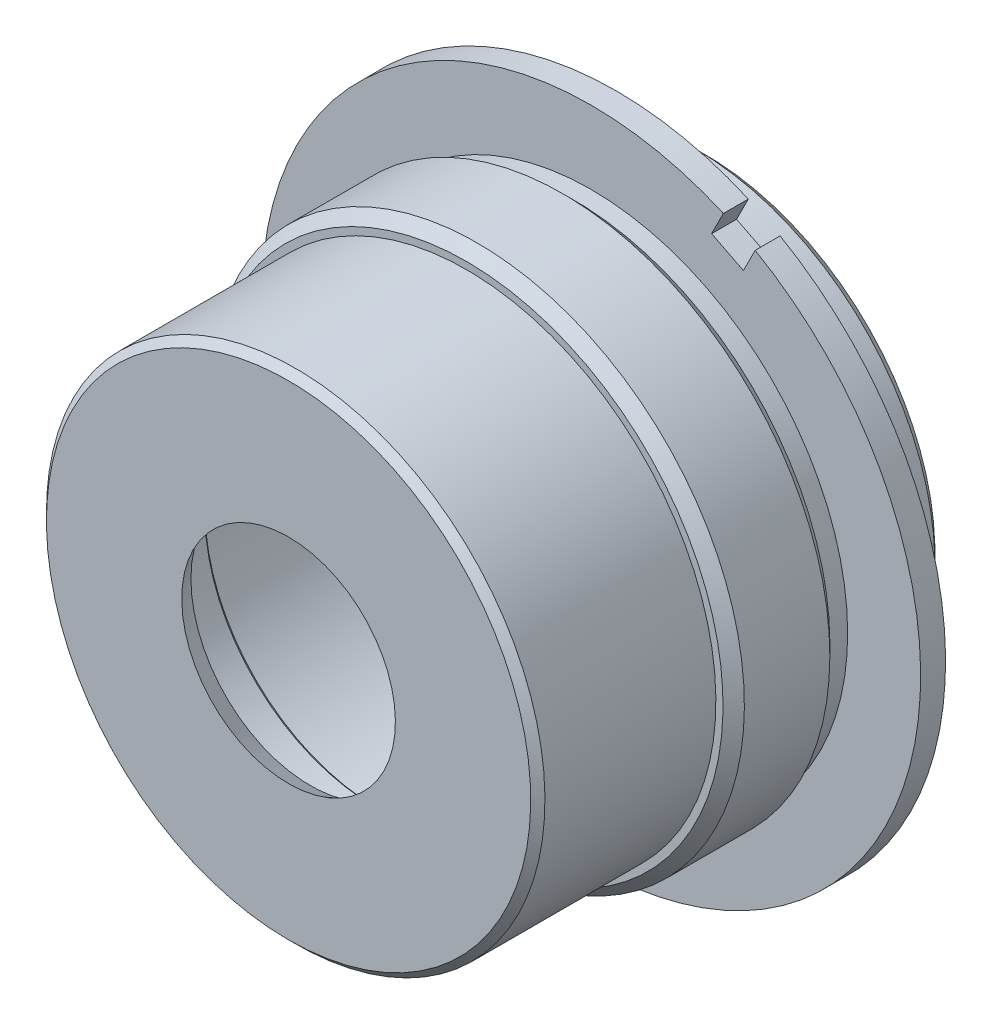
ISO-10303-21;
HEADER;
FILE_DESCRIPTION(('STEP AP214'),'2;1');
FILE_NAME('part.step','',(''),(''),'','','');
FILE_SCHEMA(('AUTOMOTIVE_DESIGN { 1 0 10303 214 1 1 1 1 }'));
ENDSEC;
DATA;
#1=APPLICATION_CONTEXT('core data for automotive mechanical design processes');
#2=APPLICATION_PROTOCOL_DEFINITION('international standard','automotive_design',2000,#1);
#3=PRODUCT_CONTEXT('',#1,'mechanical');
#4=PRODUCT('Part','Part','',(#3));
#5=PRODUCT_RELATED_PRODUCT_CATEGORY('part','',(#4));
#6=PRODUCT_DEFINITION_FORMATION('','',#4);
#7=PRODUCT_DEFINITION_CONTEXT('part definition',#1,'design');
#8=PRODUCT_DEFINITION('design','',#6,#7);
#9=PRODUCT_DEFINITION_SHAPE('','',#8);
#10=(LENGTH_UNIT() NAMED_UNIT(*) SI_UNIT(.MILLI.,.METRE.));
#11=(NAMED_UNIT(*) PLANE_ANGLE_UNIT() SI_UNIT($,.RADIAN.));
#12=(NAMED_UNIT(*) SI_UNIT($,.STERADIAN.) SOLID_ANGLE_UNIT());
#13=UNCERTAINTY_MEASURE_WITH_UNIT(LENGTH_MEASURE(1.E-05),#10,'distance_accuracy_value','');
#14=(GEOMETRIC_REPRESENTATION_CONTEXT(3) GLOBAL_UNCERTAINTY_ASSIGNED_CONTEXT((#13)) GLOBAL_UNIT_ASSIGNED_CONTEXT((#10,
#11,#12)) REPRESENTATION_CONTEXT('',''));
#15=CARTESIAN_POINT('',(0.,0.,0.));
#16=DIRECTION('',(0.,0.,1.));
#17=DIRECTION('',(1.,0.,0.));
#18=AXIS2_PLACEMENT_3D('',#15,#16,#17);
#19=CARTESIAN_POINT('',(-3.37937907791445,-7.81535648884644,0.204999999995237));
#20=DIRECTION('',(0.450102074575118,0.892977111948103,0.));
#21=DIRECTION('',(0.892977111948103,-0.450102074575118,0.));
#22=AXIS2_PLACEMENT_3D('',#19,#20,#21);
#23=PLANE('',#22);
#24=DIRECTION('',(0.,0.,-1.));
#25=VECTOR('',#24,1.);
#26=CARTESIAN_POINT('',(-4.27235618986256,-7.36525441427132,0.204999999995237));
#27=LINE('',#26,#25);
#28=CARTESIAN_POINT('',(-4.27235618986256,-7.36525441427132,-8.29500000000476));
#29=VERTEX_POINT('',#28);
#30=CARTESIAN_POINT('',(-4.27235618986256,-7.36525441427132,-8.995));
#31=VERTEX_POINT('',#30);
#32=EDGE_CURVE('E27',#29,#31,#27,.T.);
#33=ORIENTED_EDGE('',*,*,#32,.T.);
#34=DIRECTION('',(0.892977111948103,-0.450102074575118,0.));
#35=VECTOR('',#34,1.);
#36=CARTESIAN_POINT('',(-3.37937907791445,-7.81535648884644,-8.995));
#37=LINE('',#36,#35);
#38=CARTESIAN_POINT('',(-3.37937907791445,-7.81535648884644,-8.995));
#39=VERTEX_POINT('',#38);
#40=EDGE_CURVE('E265',#31,#39,#37,.T.);
#41=ORIENTED_EDGE('',*,*,#40,.T.);
#42=DIRECTION('',(0.,0.,-1.));
#43=VECTOR('',#42,1.);
#44=CARTESIAN_POINT('',(-3.37937907791445,-7.81535648884644,0.204999999995237));
#45=LINE('',#44,#43);
#46=CARTESIAN_POINT('',(-3.37937907791445,-7.81535648884644,-8.29500000000476));
#47=VERTEX_POINT('',#46);
#48=EDGE_CURVE('E11',#47,#39,#45,.T.);
#49=ORIENTED_EDGE('',*,*,#48,.F.);
#50=DIRECTION('',(0.892977111948103,-0.450102074575118,0.));
#51=VECTOR('',#50,1.);
#52=CARTESIAN_POINT('',(-3.8258676338885,-7.59030545155888,-8.29500000000476));
#53=LINE('',#52,#51);
#54=EDGE_CURVE('E277',#29,#47,#53,.T.);
#55=ORIENTED_EDGE('',*,*,#54,.F.);
#56=EDGE_LOOP('',(#33,#41,#49,#55));
#57=FACE_BOUND('',#56,.T.);
#58=ADVANCED_FACE('F16',(#57),#23,.F.);
#59=CARTESIAN_POINT('',(-3.37937907791445,-7.81535648884644,0.204999999995237));
#60=DIRECTION('',(0.892977111948103,-0.450102074575118,0.));
#61=DIRECTION('',(0.450102074575118,0.892977111948103,0.));
#62=AXIS2_PLACEMENT_3D('',#59,#60,#61);
#63=PLANE('',#62);
#64=ORIENTED_EDGE('',*,*,#48,.T.);
#65=DIRECTION('',(-0.450102074575118,-0.892977111948103,0.));
#66=VECTOR('',#65,1.);
#67=CARTESIAN_POINT('',(-3.37937907791445,-7.81535648884644,-8.995));
#68=LINE('',#67,#66);
#69=CARTESIAN_POINT('',(-3.71086872388059,-8.4730132369851,-8.995));
#70=VERTEX_POINT('',#69);
#71=EDGE_CURVE('E20',#39,#70,#68,.T.);
#72=ORIENTED_EDGE('',*,*,#71,.T.);
#73=DIRECTION('',(0.,0.,-1.));
#74=VECTOR('',#73,1.);
#75=CARTESIAN_POINT('',(-3.71086872388059,-8.4730132369851,1.20499999999524));
#76=LINE('',#75,#74);
#77=CARTESIAN_POINT('',(-3.71086872388059,-8.4730132369851,-8.29500000000476));
#78=VERTEX_POINT('',#77);
#79=EDGE_CURVE('E248',#78,#70,#76,.T.);
#80=ORIENTED_EDGE('',*,*,#79,.F.);
#81=DIRECTION('',(-0.450102074575118,-0.892977111948103,0.));
#82=VECTOR('',#81,1.);
#83=CARTESIAN_POINT('',(4.60993274579388,8.03498724823239,-8.29500000000476));
#84=LINE('',#83,#82);
#85=EDGE_CURVE('E302',#47,#78,#84,.T.);
#86=ORIENTED_EDGE('',*,*,#85,.F.);
#87=EDGE_LOOP('',(#64,#72,#80,#86));
#88=FACE_BOUND('',#87,.T.);
#89=ADVANCED_FACE('F577',(#88),#63,.F.);
#90=CARTESIAN_POINT('',(-4.27235618986256,-7.36525441427132,0.204999999995237));
#91=DIRECTION('',(-0.892977111948103,0.450102074575118,0.));
#92=DIRECTION('',(0.450102074575118,0.892977111948103,0.));
#93=AXIS2_PLACEMENT_3D('',#90,#91,#92);
#94=PLANE('',#93);
#95=DIRECTION('',(0.,0.,1.));
#96=VECTOR('',#95,1.);
#97=CARTESIAN_POINT('',(-4.60384583582869,-8.02291116240999,1.20499999999524));
#98=LINE('',#97,#96);
#99=CARTESIAN_POINT('',(-4.60384583582869,-8.02291116240999,-8.995));
#100=VERTEX_POINT('',#99);
#101=CARTESIAN_POINT('',(-4.60384583582869,-8.02291116240999,-8.29500000000476));
#102=VERTEX_POINT('',#101);
#103=EDGE_CURVE('E230',#100,#102,#98,.T.);
#104=ORIENTED_EDGE('',*,*,#103,.F.);
#105=DIRECTION('',(-0.450102074575118,-0.892977111948103,0.));
#106=VECTOR('',#105,1.);
#107=CARTESIAN_POINT('',(3.71695563384578,8.48508932280751,-8.995));
#108=LINE('',#107,#106);
#109=EDGE_CURVE('E213',#31,#100,#108,.T.);
#110=ORIENTED_EDGE('',*,*,#109,.F.);
#111=ORIENTED_EDGE('',*,*,#32,.F.);
#112=DIRECTION('',(0.450102074575118,0.892977111948103,0.));
#113=VECTOR('',#112,1.);
#114=CARTESIAN_POINT('',(3.71695563384578,8.48508932280751,-8.29500000000476));
#115=LINE('',#114,#113);
#116=EDGE_CURVE('E223',#102,#29,#115,.T.);
#117=ORIENTED_EDGE('',*,*,#116,.F.);
#118=EDGE_LOOP('',(#104,#110,#111,#117));
#119=FACE_BOUND('',#118,.T.);
#120=ADVANCED_FACE('F442',(#119),#94,.F.);
#121=CARTESIAN_POINT('',(4.27235618986256,7.36525441427132,0.204999999995237));
#122=DIRECTION('',(0.892977111948103,-0.450102074575118,0.));
#123=DIRECTION('',(-0.450102074575118,-0.892977111948103,0.));
#124=AXIS2_PLACEMENT_3D('',#121,#122,#123);
#125=PLANE('',#124);
#126=DIRECTION('',(0.,0.,1.));
#127=VECTOR('',#126,1.);
#128=CARTESIAN_POINT('',(4.60384583582869,8.02291116240998,1.20499999999524));
#129=LINE('',#128,#127);
#130=CARTESIAN_POINT('',(4.60384583582869,8.02291116240998,-8.995));
#131=VERTEX_POINT('',#130);
#132=CARTESIAN_POINT('',(4.60384583582869,8.02291116240998,-8.29500000000476));
#133=VERTEX_POINT('',#132);
#134=EDGE_CURVE('E249',#131,#133,#129,.T.);
#135=ORIENTED_EDGE('',*,*,#134,.F.);
#136=DIRECTION('',(0.450102074575118,0.892977111948103,0.));
#137=VECTOR('',#136,1.);
#138=CARTESIAN_POINT('',(4.60993274579389,8.03498724823239,-8.995));
#139=LINE('',#138,#137);
#140=CARTESIAN_POINT('',(4.27235618986256,7.36525441427132,-8.995));
#141=VERTEX_POINT('',#140);
#142=EDGE_CURVE('E253',#141,#131,#139,.T.);
#143=ORIENTED_EDGE('',*,*,#142,.F.);
#144=DIRECTION('',(0.,0.,-1.));
#145=VECTOR('',#144,1.);
#146=CARTESIAN_POINT('',(4.27235618986256,7.36525441427132,0.204999999995237));
#147=LINE('',#146,#145);
#148=CARTESIAN_POINT('',(4.27235618986256,7.36525441427132,-8.29500000000476));
#149=VERTEX_POINT('',#148);
#150=EDGE_CURVE('E42',#149,#141,#147,.T.);
#151=ORIENTED_EDGE('',*,*,#150,.F.);
#152=DIRECTION('',(-0.450102074575118,-0.892977111948103,0.));
#153=VECTOR('',#152,1.);
#154=CARTESIAN_POINT('',(4.60993274579389,8.03498724823239,-8.29500000000476));
#155=LINE('',#154,#153);
#156=EDGE_CURVE('E297',#133,#149,#155,.T.);
#157=ORIENTED_EDGE('',*,*,#156,.F.);
#158=EDGE_LOOP('',(#135,#143,#151,#157));
#159=FACE_BOUND('',#158,.T.);
#160=ADVANCED_FACE('F430',(#159),#125,.F.);
#161=CARTESIAN_POINT('',(4.27235618986256,7.36525441427132,0.204999999995237));
#162=DIRECTION('',(-0.450102074575118,-0.892977111948103,0.));
#163=DIRECTION('',(0.,0.,-1.));
#164=AXIS2_PLACEMENT_3D('',#161,#162,#163);
#165=PLANE('',#164);
#166=ORIENTED_EDGE('',*,*,#150,.T.);
#167=DIRECTION('',(-0.892977111948103,0.450102074575118,0.));
#168=VECTOR('',#167,1.);
#169=CARTESIAN_POINT('',(4.27235618986256,7.36525441427132,-8.995));
#170=LINE('',#169,#168);
#171=CARTESIAN_POINT('',(3.37937907791445,7.81535648884644,-8.995));
#172=VERTEX_POINT('',#171);
#173=EDGE_CURVE('E212',#141,#172,#170,.T.);
#174=ORIENTED_EDGE('',*,*,#173,.T.);
#175=DIRECTION('',(0.,0.,-1.));
#176=VECTOR('',#175,1.);
#177=CARTESIAN_POINT('',(3.37937907791445,7.81535648884644,0.204999999995237));
#178=LINE('',#177,#176);
#179=CARTESIAN_POINT('',(3.37937907791445,7.81535648884644,-8.29500000000476));
#180=VERTEX_POINT('',#179);
#181=EDGE_CURVE('E207',#180,#172,#178,.T.);
#182=ORIENTED_EDGE('',*,*,#181,.F.);
#183=DIRECTION('',(-0.892977111948103,0.450102074575118,0.));
#184=VECTOR('',#183,1.);
#185=CARTESIAN_POINT('',(3.8258676338885,7.59030545155888,-8.29500000000476));
#186=LINE('',#185,#184);
#187=EDGE_CURVE('E301',#149,#180,#186,.T.);
#188=ORIENTED_EDGE('',*,*,#187,.F.);
#189=EDGE_LOOP('',(#166,#174,#182,#188));
#190=FACE_BOUND('',#189,.T.);
#191=ADVANCED_FACE('F425',(#190),#165,.F.);
#192=CARTESIAN_POINT('',(3.37937907791445,7.81535648884644,0.204999999995237));
#193=DIRECTION('',(-0.892977111948103,0.450102074575118,0.));
#194=DIRECTION('',(0.,0.,1.));
#195=AXIS2_PLACEMENT_3D('',#192,#193,#194);
#196=PLANE('',#195);
#197=ORIENTED_EDGE('',*,*,#181,.T.);
#198=DIRECTION('',(0.450102074575118,0.892977111948103,0.));
#199=VECTOR('',#198,1.);
#200=CARTESIAN_POINT('',(3.37937907791445,7.81535648884644,-8.995));
#201=LINE('',#200,#199);
#202=CARTESIAN_POINT('',(3.71086872388059,8.4730132369851,-8.995));
#203=VERTEX_POINT('',#202);
#204=EDGE_CURVE('E201',#172,#203,#201,.T.);
#205=ORIENTED_EDGE('',*,*,#204,.T.);
#206=DIRECTION('',(0.,0.,-1.));
#207=VECTOR('',#206,1.);
#208=CARTESIAN_POINT('',(3.71086872388059,8.4730132369851,1.20499999999524));
#209=LINE('',#208,#207);
#210=CARTESIAN_POINT('',(3.71086872388059,8.4730132369851,-8.29500000000476));
#211=VERTEX_POINT('',#210);
#212=EDGE_CURVE('E205',#211,#203,#209,.T.);
#213=ORIENTED_EDGE('',*,*,#212,.F.);
#214=DIRECTION('',(0.450102074575118,0.892977111948103,0.));
#215=VECTOR('',#214,1.);
#216=CARTESIAN_POINT('',(3.71695563384578,8.4850893228075,-8.29500000000476));
#217=LINE('',#216,#215);
#218=EDGE_CURVE('E269',#180,#211,#217,.T.);
#219=ORIENTED_EDGE('',*,*,#218,.F.);
#220=EDGE_LOOP('',(#197,#205,#213,#219));
#221=FACE_BOUND('',#220,.T.);
#222=ADVANCED_FACE('F203',(#221),#196,.F.);
#223=CARTESIAN_POINT('',(2.90315838101721,5.75970237208055,-11.4949999999993));
#224=DIRECTION('',(0.,0.,1.));
#225=DIRECTION('',(0.892977111948103,-0.450102074575118,0.));
#226=AXIS2_PLACEMENT_3D('',#223,#224,#225);
#227=PLANE('',#226);
#228=CARTESIAN_POINT('',(0.,0.,-11.4949999999993));
#229=DIRECTION('',(0.,0.,1.));
#230=DIRECTION('',(0.892977111948103,-0.450102074575118,0.));
#231=AXIS2_PLACEMENT_3D('',#228,#229,#230);
#232=CIRCLE('',#231,5.70000000009555);
#233=CARTESIAN_POINT('',(-5.08996953818951,2.56558182512118,-11.4949999999993));
#234=VERTEX_POINT('',#233);
#235=EDGE_CURVE('E283',#234,#234,#232,.T.);
#236=ORIENTED_EDGE('',*,*,#235,.T.);
#237=EDGE_LOOP('',(#236));
#238=FACE_BOUND('',#237,.T.);
#239=CARTESIAN_POINT('',(0.,0.,-11.4949999999993));
#240=DIRECTION('',(0.,0.,1.));
#241=DIRECTION('',(0.892977111948103,-0.450102074575118,0.));
#242=AXIS2_PLACEMENT_3D('',#239,#240,#241);
#243=CIRCLE('',#242,6.45000000001711);
#244=CARTESIAN_POINT('',(-5.75970237208055,2.90315838101721,-11.4949999999993));
#245=VERTEX_POINT('',#244);
#246=EDGE_CURVE('E286',#245,#245,#243,.T.);
#247=ORIENTED_EDGE('',*,*,#246,.F.);
#248=EDGE_LOOP('',(#247));
#249=FACE_BOUND('',#248,.T.);
#250=ADVANCED_FACE('F388',(#238,#249),#227,.F.);
#251=CARTESIAN_POINT('',(4.16344418981983,8.26003828551995,-8.995));
#252=DIRECTION('',(0.,0.,1.));
#253=DIRECTION('',(0.892977111948103,-0.450102074575118,0.));
#254=AXIS2_PLACEMENT_3D('',#251,#252,#253);
#255=PLANE('',#254);
#256=CARTESIAN_POINT('',(0.,0.,-8.995));
#257=DIRECTION('',(0.,0.,1.));
#258=DIRECTION('',(0.892977111948103,-0.450102074575118,0.));
#259=AXIS2_PLACEMENT_3D('',#256,#257,#258);
#260=CIRCLE('',#259,6.45000000001711);
#261=CARTESIAN_POINT('',(5.75970237208055,-2.90315838101721,-8.995));
#262=VERTEX_POINT('',#261);
#263=EDGE_CURVE('E242',#262,#262,#260,.T.);
#264=ORIENTED_EDGE('',*,*,#263,.T.);
#265=EDGE_LOOP('',(#264));
#266=FACE_BOUND('',#265,.T.);
#267=ORIENTED_EDGE('',*,*,#40,.F.);
#268=ORIENTED_EDGE('',*,*,#109,.T.);
#269=CARTESIAN_POINT('',(0.,0.,-8.995));
#270=DIRECTION('',(0.,0.,1.));
#271=DIRECTION('',(0.892977111948103,-0.450102074575118,0.));
#272=AXIS2_PLACEMENT_3D('',#269,#270,#271);
#273=CIRCLE('',#272,9.25);
#274=EDGE_CURVE('E219',#203,#100,#273,.T.);
#275=ORIENTED_EDGE('',*,*,#274,.F.);
#276=ORIENTED_EDGE('',*,*,#204,.F.);
#277=ORIENTED_EDGE('',*,*,#173,.F.);
#278=ORIENTED_EDGE('',*,*,#142,.T.);
#279=CARTESIAN_POINT('',(0.,0.,-8.995));
#280=DIRECTION('',(0.,0.,1.));
#281=DIRECTION('',(0.892977111948103,-0.450102074575118,0.));
#282=AXIS2_PLACEMENT_3D('',#279,#280,#281);
#283=CIRCLE('',#282,9.25);
#284=EDGE_CURVE('E244',#70,#131,#283,.T.);
#285=ORIENTED_EDGE('',*,*,#284,.F.);
#286=ORIENTED_EDGE('',*,*,#71,.F.);
#287=EDGE_LOOP('',(#267,#268,#275,#276,#277,#278,#285,#286));
#288=FACE_BOUND('',#287,.T.);
#289=ADVANCED_FACE('F226',(#266,#288),#255,.F.);
#290=CARTESIAN_POINT('',(4.16344418981983,8.26003828551995,-8.29500000000476));
#291=DIRECTION('',(0.,0.,-1.));
#292=DIRECTION('',(-0.450102074575118,-0.892977111948103,0.));
#293=AXIS2_PLACEMENT_3D('',#290,#291,#292);
#294=PLANE('',#293);
#295=CARTESIAN_POINT('',(0.,0.,-8.29500000000476));
#296=DIRECTION('',(0.,0.,1.));
#297=DIRECTION('',(0.892977111948103,-0.450102074575118,0.));
#298=AXIS2_PLACEMENT_3D('',#295,#296,#297);
#299=CIRCLE('',#298,7.20000000001166);
#300=CARTESIAN_POINT('',(-6.42943520603675,3.2407349369461,-8.29500000000476));
#301=VERTEX_POINT('',#300);
#302=EDGE_CURVE('E264',#301,#301,#299,.T.);
#303=ORIENTED_EDGE('',*,*,#302,.F.);
#304=EDGE_LOOP('',(#303));
#305=FACE_BOUND('',#304,.T.);
#306=CARTESIAN_POINT('',(0.,0.,-8.29500000000476));
#307=DIRECTION('',(0.,0.,1.));
#308=DIRECTION('',(0.892977111948103,-0.450102074575118,0.));
#309=AXIS2_PLACEMENT_3D('',#306,#307,#308);
#310=CIRCLE('',#309,9.25);
#311=EDGE_CURVE('E221',#211,#102,#310,.T.);
#312=ORIENTED_EDGE('',*,*,#311,.T.);
#313=ORIENTED_EDGE('',*,*,#116,.T.);
#314=ORIENTED_EDGE('',*,*,#54,.T.);
#315=ORIENTED_EDGE('',*,*,#85,.T.);
#316=CARTESIAN_POINT('',(0.,0.,-8.29500000000476));
#317=DIRECTION('',(0.,0.,1.));
#318=DIRECTION('',(0.892977111948103,-0.450102074575118,0.));
#319=AXIS2_PLACEMENT_3D('',#316,#317,#318);
#320=CIRCLE('',#319,9.25);
#321=EDGE_CURVE('E245',#78,#133,#320,.T.);
#322=ORIENTED_EDGE('',*,*,#321,.T.);
#323=ORIENTED_EDGE('',*,*,#156,.T.);
#324=ORIENTED_EDGE('',*,*,#187,.T.);
#325=ORIENTED_EDGE('',*,*,#218,.T.);
#326=EDGE_LOOP('',(#312,#313,#314,#315,#322,#323,#324,#325));
#327=FACE_BOUND('',#326,.T.);
#328=ADVANCED_FACE('F387',(#305,#327),#294,.F.);
#329=CARTESIAN_POINT('',(3.2407349369461,6.42943520603675,-4.79500000000475));
#330=DIRECTION('',(0.,0.,-1.));
#331=DIRECTION('',(-0.450102074575118,-0.892977111948103,0.));
#332=AXIS2_PLACEMENT_3D('',#329,#330,#331);
#333=PLANE('',#332);
#334=CARTESIAN_POINT('',(0.,0.,-4.79500000000475));
#335=DIRECTION('',(0.,0.,1.));
#336=DIRECTION('',(0.892977111948103,-0.450102074575118,0.));
#337=AXIS2_PLACEMENT_3D('',#334,#335,#336);
#338=CIRCLE('',#337,7.);
#339=CARTESIAN_POINT('',(-6.25083978363672,3.15071452202582,-4.79500000000475));
#340=VERTEX_POINT('',#339);
#341=EDGE_CURVE('E273',#340,#340,#338,.T.);
#342=ORIENTED_EDGE('',*,*,#341,.F.);
#343=EDGE_LOOP('',(#342));
#344=FACE_BOUND('',#343,.T.);
#345=CARTESIAN_POINT('',(0.,0.,-4.79500000000475));
#346=DIRECTION('',(0.,0.,1.));
#347=DIRECTION('',(0.892977111948103,-0.450102074575118,0.));
#348=AXIS2_PLACEMENT_3D('',#345,#346,#347);
#349=CIRCLE('',#348,7.20000000001166);
#350=CARTESIAN_POINT('',(-6.42943520603675,3.2407349369461,-4.79500000000475));
#351=VERTEX_POINT('',#350);
#352=EDGE_CURVE('E317',#351,#351,#349,.T.);
#353=ORIENTED_EDGE('',*,*,#352,.T.);
#354=EDGE_LOOP('',(#353));
#355=FACE_BOUND('',#354,.T.);
#356=ADVANCED_FACE('F529',(#344,#355),#333,.F.);
#357=CARTESIAN_POINT('',(3.0606941071108,6.0722443612471,0.204999999995237));
#358=DIRECTION('',(0.,0.,-1.));
#359=DIRECTION('',(-0.450102074575118,-0.892977111948103,0.));
#360=AXIS2_PLACEMENT_3D('',#357,#358,#359);
#361=PLANE('',#360);
#362=CARTESIAN_POINT('',(0.,0.,0.204999999995237));
#363=DIRECTION('',(0.,0.,1.));
#364=DIRECTION('',(0.892977111948103,-0.450102074575118,0.));
#365=AXIS2_PLACEMENT_3D('',#362,#363,#364);
#366=CIRCLE('',#365,3.);
#367=CARTESIAN_POINT('',(2.6789313358443,-1.35030622372535,0.204999999995237));
#368=VERTEX_POINT('',#367);
#369=EDGE_CURVE('E254',#368,#368,#366,.T.);
#370=ORIENTED_EDGE('',*,*,#369,.F.);
#371=EDGE_LOOP('',(#370));
#372=FACE_BOUND('',#371,.T.);
#373=CARTESIAN_POINT('',(0.,0.,0.204999999995237));
#374=DIRECTION('',(0.,0.,1.));
#375=DIRECTION('',(0.892977111948103,-0.450102074575118,0.));
#376=AXIS2_PLACEMENT_3D('',#373,#374,#375);
#377=CIRCLE('',#376,6.8);
#378=CARTESIAN_POINT('',(-6.0722443612471,3.0606941071108,0.204999999995237));
#379=VERTEX_POINT('',#378);
#380=EDGE_CURVE('E258',#379,#379,#377,.T.);
#381=ORIENTED_EDGE('',*,*,#380,.T.);
#382=EDGE_LOOP('',(#381));
#383=FACE_BOUND('',#382,.T.);
#384=ADVANCED_FACE('F404',(#372,#383),#361,.F.);
#385=CARTESIAN_POINT('',(2.13798485427237,4.24164128183395,-0.40499999999931));
#386=DIRECTION('',(0.,0.,1.));
#387=DIRECTION('',(0.892977111948103,-0.450102074575118,0.));
#388=AXIS2_PLACEMENT_3D('',#385,#386,#387);
#389=PLANE('',#388);
#390=CARTESIAN_POINT('',(0.,0.,-0.40499999999931));
#391=DIRECTION('',(0.,0.,1.));
#392=DIRECTION('',(0.892977111948103,-0.450102074575118,0.));
#393=AXIS2_PLACEMENT_3D('',#390,#391,#392);
#394=CIRCLE('',#393,3.35218366420253);
#395=CARTESIAN_POINT('',(-2.99342328717918,1.50882482161437,-0.40499999999931));
#396=VERTEX_POINT('',#395);
#397=EDGE_CURVE('E257',#396,#396,#394,.T.);
#398=ORIENTED_EDGE('',*,*,#397,.T.);
#399=EDGE_LOOP('',(#398));
#400=FACE_BOUND('',#399,.T.);
#401=CARTESIAN_POINT('',(0.,0.,-0.40499999999931));
#402=DIRECTION('',(0.,0.,1.));
#403=DIRECTION('',(0.892977111948103,-0.450102074575118,0.));
#404=AXIS2_PLACEMENT_3D('',#401,#402,#403);
#405=CIRCLE('',#404,4.7500000000901);
#406=CARTESIAN_POINT('',(4.24164128183395,-2.13798485427237,-0.40499999999931));
#407=VERTEX_POINT('',#406);
#408=EDGE_CURVE('E239',#407,#407,#405,.T.);
#409=ORIENTED_EDGE('',*,*,#408,.F.);
#410=EDGE_LOOP('',(#409));
#411=FACE_BOUND('',#410,.T.);
#412=ADVANCED_FACE('F398',(#400,#411),#389,.F.);
#413=CARTESIAN_POINT('',(2.47556141020597,4.91137411579953,-2.29500000000475));
#414=DIRECTION('',(0.,0.,1.));
#415=DIRECTION('',(0.892977111948103,-0.450102074575118,0.));
#416=AXIS2_PLACEMENT_3D('',#413,#414,#415);
#417=PLANE('',#416);
#418=CARTESIAN_POINT('',(0.,0.,-2.29500000000475));
#419=DIRECTION('',(0.,0.,1.));
#420=DIRECTION('',(0.892977111948103,-0.450102074575118,0.));
#421=AXIS2_PLACEMENT_3D('',#418,#419,#420);
#422=CIRCLE('',#421,4.85000000009009);
#423=CARTESIAN_POINT('',(-4.33093899302874,2.18299506172987,-2.29500000000475));
#424=VERTEX_POINT('',#423);
#425=EDGE_CURVE('E231',#424,#424,#422,.T.);
#426=ORIENTED_EDGE('',*,*,#425,.T.);
#427=EDGE_LOOP('',(#426));
#428=FACE_BOUND('',#427,.T.);
#429=CARTESIAN_POINT('',(0.,0.,-2.29500000000475));
#430=DIRECTION('',(0.,0.,1.));
#431=DIRECTION('',(0.892977111948103,-0.450102074575118,0.));
#432=AXIS2_PLACEMENT_3D('',#429,#430,#431);
#433=CIRCLE('',#432,5.50000000009515);
#434=CARTESIAN_POINT('',(4.91137411579953,-2.47556141020597,-2.29500000000475));
#435=VERTEX_POINT('',#434);
#436=EDGE_CURVE('E287',#435,#435,#433,.T.);
#437=ORIENTED_EDGE('',*,*,#436,.F.);
#438=EDGE_LOOP('',(#437));
#439=FACE_BOUND('',#438,.T.);
#440=ADVANCED_FACE('F403',(#428,#439),#417,.F.);
#441=CARTESIAN_POINT('',(0.,0.,1.20499999999524));
#442=DIRECTION('',(0.,0.,1.));
#443=DIRECTION('',(0.892977111948103,-0.450102074575118,0.));
#444=AXIS2_PLACEMENT_3D('',#441,#442,#443);
#445=CYLINDRICAL_SURFACE('',#444,9.25);
#446=ORIENTED_EDGE('',*,*,#274,.T.);
#447=ORIENTED_EDGE('',*,*,#103,.T.);
#448=ORIENTED_EDGE('',*,*,#311,.F.);
#449=ORIENTED_EDGE('',*,*,#212,.T.);
#450=EDGE_LOOP('',(#446,#447,#448,#449));
#451=FACE_BOUND('',#450,.T.);
#452=ADVANCED_FACE('F217',(#451),#445,.T.);
#453=CARTESIAN_POINT('',(0.,0.,-2.19500000000476));
#454=DIRECTION('',(0.,0.,-1.));
#455=DIRECTION('',(-0.892977111948103,0.450102074575118,0.));
#456=AXIS2_PLACEMENT_3D('',#453,#454,#455);
#457=CONICAL_SURFACE('',#456,4.7500000000901,0.785398163397448);
#458=ORIENTED_EDGE('',*,*,#425,.F.);
#459=EDGE_LOOP('',(#458));
#460=FACE_BOUND('',#459,.T.);
#461=CARTESIAN_POINT('',(0.,0.,-2.19500000000476));
#462=DIRECTION('',(0.,0.,1.));
#463=DIRECTION('',(0.892977111948103,-0.450102074575118,0.));
#464=AXIS2_PLACEMENT_3D('',#461,#462,#463);
#465=CIRCLE('',#464,4.7500000000901);
#466=CARTESIAN_POINT('',(4.24164128183395,-2.13798485427237,-2.19500000000476));
#467=VERTEX_POINT('',#466);
#468=EDGE_CURVE('E293',#467,#467,#465,.T.);
#469=ORIENTED_EDGE('',*,*,#468,.T.);
#470=EDGE_LOOP('',(#469));
#471=FACE_BOUND('',#470,.T.);
#472=ADVANCED_FACE('F18',(#460,#471),#457,.F.);
#473=CARTESIAN_POINT('',(0.,0.,1.20499999999524));
#474=DIRECTION('',(0.,0.,1.));
#475=DIRECTION('',(0.892977111948103,-0.450102074575118,0.));
#476=AXIS2_PLACEMENT_3D('',#473,#474,#475);
#477=CYLINDRICAL_SURFACE('',#476,4.7500000000901);
#478=ORIENTED_EDGE('',*,*,#408,.T.);
#479=EDGE_LOOP('',(#478));
#480=FACE_BOUND('',#479,.T.);
#481=ORIENTED_EDGE('',*,*,#468,.F.);
#482=EDGE_LOOP('',(#481));
#483=FACE_BOUND('',#482,.T.);
#484=ADVANCED_FACE('F562',(#480,#483),#477,.F.);
#485=CARTESIAN_POINT('',(0.,0.,0.204999999995237));
#486=DIRECTION('',(0.,0.,-1.));
#487=DIRECTION('',(-0.892977111948103,0.450102074575118,0.));
#488=AXIS2_PLACEMENT_3D('',#485,#486,#487);
#489=CONICAL_SURFACE('',#488,3.,0.523598775598299);
#490=ORIENTED_EDGE('',*,*,#397,.F.);
#491=EDGE_LOOP('',(#490));
#492=FACE_BOUND('',#491,.T.);
#493=ORIENTED_EDGE('',*,*,#369,.T.);
#494=EDGE_LOOP('',(#493));
#495=FACE_BOUND('',#494,.T.);
#496=ADVANCED_FACE('F567',(#492,#495),#489,.F.);
#497=CARTESIAN_POINT('',(0.,0.,0.00499999999524547));
#498=DIRECTION('',(0.,0.,-1.));
#499=DIRECTION('',(-0.892977111948103,0.450102074575118,0.));
#500=AXIS2_PLACEMENT_3D('',#497,#498,#499);
#501=CONICAL_SURFACE('',#500,7.,0.785398163397466);
#502=CARTESIAN_POINT('',(0.,0.,0.00499999999524547));
#503=DIRECTION('',(0.,0.,1.));
#504=DIRECTION('',(0.892977111948103,-0.450102074575118,0.));
#505=AXIS2_PLACEMENT_3D('',#502,#503,#504);
#506=CIRCLE('',#505,7.);
#507=CARTESIAN_POINT('',(6.25083978363672,-3.15071452202582,0.00499999999524547));
#508=VERTEX_POINT('',#507);
#509=EDGE_CURVE('E270',#508,#508,#506,.T.);
#510=ORIENTED_EDGE('',*,*,#509,.T.);
#511=EDGE_LOOP('',(#510));
#512=FACE_BOUND('',#511,.T.);
#513=ORIENTED_EDGE('',*,*,#380,.F.);
#514=EDGE_LOOP('',(#513));
#515=FACE_BOUND('',#514,.T.);
#516=ADVANCED_FACE('F543',(#512,#515),#501,.T.);
#517=CARTESIAN_POINT('',(0.,0.,1.20499999999524));
#518=DIRECTION('',(0.,0.,1.));
#519=DIRECTION('',(0.892977111948103,-0.450102074575118,0.));
#520=AXIS2_PLACEMENT_3D('',#517,#518,#519);
#521=CYLINDRICAL_SURFACE('',#520,7.);
#522=ORIENTED_EDGE('',*,*,#509,.F.);
#523=EDGE_LOOP('',(#522));
#524=FACE_BOUND('',#523,.T.);
#525=ORIENTED_EDGE('',*,*,#341,.T.);
#526=EDGE_LOOP('',(#525));
#527=FACE_BOUND('',#526,.T.);
#528=ADVANCED_FACE('F538',(#524,#527),#521,.T.);
#529=CARTESIAN_POINT('',(0.,0.,-5.09499999999853));
#530=DIRECTION('',(0.,0.,-1.));
#531=DIRECTION('',(-0.892977111948103,0.450102074575118,0.));
#532=AXIS2_PLACEMENT_3D('',#529,#530,#531);
#533=CONICAL_SURFACE('',#532,7.50000000000543,0.785398163397448);
#534=CARTESIAN_POINT('',(0.,0.,-5.09499999999853));
#535=DIRECTION('',(0.,0.,1.));
#536=DIRECTION('',(0.892977111948103,-0.450102074575118,0.));
#537=AXIS2_PLACEMENT_3D('',#534,#535,#536);
#538=CIRCLE('',#537,7.50000000000543);
#539=CARTESIAN_POINT('',(6.69732833961562,-3.37576555931583,-5.09499999999853));
#540=VERTEX_POINT('',#539);
#541=EDGE_CURVE('E169',#540,#540,#538,.T.);
#542=ORIENTED_EDGE('',*,*,#541,.T.);
#543=EDGE_LOOP('',(#542));
#544=FACE_BOUND('',#543,.T.);
#545=ORIENTED_EDGE('',*,*,#352,.F.);
#546=EDGE_LOOP('',(#545));
#547=FACE_BOUND('',#546,.T.);
#548=ADVANCED_FACE('F470',(#544,#547),#533,.T.);
#549=CARTESIAN_POINT('',(0.,0.,1.20499999999524));
#550=DIRECTION('',(0.,0.,1.));
#551=DIRECTION('',(0.892977111948103,-0.450102074575118,0.));
#552=AXIS2_PLACEMENT_3D('',#549,#550,#551);
#553=CYLINDRICAL_SURFACE('',#552,7.50000000000543);
#554=ORIENTED_EDGE('',*,*,#541,.F.);
#555=EDGE_LOOP('',(#554));
#556=FACE_BOUND('',#555,.T.);
#557=CARTESIAN_POINT('',(0.,0.,-7.495));
#558=DIRECTION('',(0.,0.,1.));
#559=DIRECTION('',(0.892977111948103,-0.450102074575118,0.));
#560=AXIS2_PLACEMENT_3D('',#557,#558,#559);
#561=CIRCLE('',#560,7.50000000000543);
#562=CARTESIAN_POINT('',(6.69732833961562,-3.37576555931583,-7.495));
#563=VERTEX_POINT('',#562);
#564=EDGE_CURVE('E176',#563,#563,#561,.T.);
#565=ORIENTED_EDGE('',*,*,#564,.T.);
#566=EDGE_LOOP('',(#565));
#567=FACE_BOUND('',#566,.T.);
#568=ADVANCED_FACE('F464',(#556,#567),#553,.T.);
#569=CARTESIAN_POINT('',(0.,0.,-7.79500000000476));
#570=DIRECTION('',(0.,0.,1.));
#571=DIRECTION('',(0.892977111948103,-0.450102074575118,0.));
#572=AXIS2_PLACEMENT_3D('',#569,#570,#571);
#573=CONICAL_SURFACE('',#572,7.20000000001166,0.785398163379199);
#574=ORIENTED_EDGE('',*,*,#564,.F.);
#575=EDGE_LOOP('',(#574));
#576=FACE_BOUND('',#575,.T.);
#577=CARTESIAN_POINT('',(0.,0.,-7.79500000000476));
#578=DIRECTION('',(0.,0.,1.));
#579=DIRECTION('',(0.892977111948103,-0.450102074575118,0.));
#580=AXIS2_PLACEMENT_3D('',#577,#578,#579);
#581=CIRCLE('',#580,7.20000000001166);
#582=CARTESIAN_POINT('',(6.42943520603675,-3.2407349369461,-7.79500000000476));
#583=VERTEX_POINT('',#582);
#584=EDGE_CURVE('E186',#583,#583,#581,.T.);
#585=ORIENTED_EDGE('',*,*,#584,.T.);
#586=EDGE_LOOP('',(#585));
#587=FACE_BOUND('',#586,.T.);
#588=ADVANCED_FACE('F469',(#576,#587),#573,.T.);
#589=CARTESIAN_POINT('',(0.,0.,1.20499999999524));
#590=DIRECTION('',(0.,0.,1.));
#591=DIRECTION('',(0.892977111948103,-0.450102074575118,0.));
#592=AXIS2_PLACEMENT_3D('',#589,#590,#591);
#593=CYLINDRICAL_SURFACE('',#592,7.20000000001166);
#594=ORIENTED_EDGE('',*,*,#584,.F.);
#595=EDGE_LOOP('',(#594));
#596=FACE_BOUND('',#595,.T.);
#597=ORIENTED_EDGE('',*,*,#302,.T.);
#598=EDGE_LOOP('',(#597));
#599=FACE_BOUND('',#598,.T.);
#600=ADVANCED_FACE('F480',(#596,#599),#593,.T.);
#601=CARTESIAN_POINT('',(0.,0.,1.20499999999524));
#602=DIRECTION('',(0.,0.,1.));
#603=DIRECTION('',(0.892977111948103,-0.450102074575118,0.));
#604=AXIS2_PLACEMENT_3D('',#601,#602,#603);
#605=CYLINDRICAL_SURFACE('',#604,9.25);
#606=ORIENTED_EDGE('',*,*,#284,.T.);
#607=ORIENTED_EDGE('',*,*,#134,.T.);
#608=ORIENTED_EDGE('',*,*,#321,.F.);
#609=ORIENTED_EDGE('',*,*,#79,.T.);
#610=EDGE_LOOP('',(#606,#607,#608,#609));
#611=FACE_BOUND('',#610,.T.);
#612=ADVANCED_FACE('F485',(#611),#605,.T.);
#613=CARTESIAN_POINT('',(0.,0.,1.20499999999524));
#614=DIRECTION('',(0.,0.,1.));
#615=DIRECTION('',(0.892977111948103,-0.450102074575118,0.));
#616=AXIS2_PLACEMENT_3D('',#613,#614,#615);
#617=CYLINDRICAL_SURFACE('',#616,6.45000000001711);
#618=ORIENTED_EDGE('',*,*,#263,.F.);
#619=EDGE_LOOP('',(#618));
#620=FACE_BOUND('',#619,.T.);
#621=CARTESIAN_POINT('',(0.,0.,-9.495));
#622=DIRECTION('',(0.,0.,1.));
#623=DIRECTION('',(0.892977111948103,-0.450102074575118,0.));
#624=AXIS2_PLACEMENT_3D('',#621,#622,#623);
#625=CIRCLE('',#624,6.45000000001711);
#626=CARTESIAN_POINT('',(-5.75970237208055,2.90315838101721,-9.495));
#627=VERTEX_POINT('',#626);
#628=EDGE_CURVE('E86',#627,#627,#625,.T.);
#629=ORIENTED_EDGE('',*,*,#628,.T.);
#630=EDGE_LOOP('',(#629));
#631=FACE_BOUND('',#630,.T.);
#632=ADVANCED_FACE('F456',(#620,#631),#617,.T.);
#633=CARTESIAN_POINT('',(0.,0.,-9.79499999999382));
#634=DIRECTION('',(0.,0.,-1.));
#635=DIRECTION('',(-0.892977111948103,0.450102074575118,0.));
#636=AXIS2_PLACEMENT_3D('',#633,#634,#635);
#637=CONICAL_SURFACE('',#636,6.75000000001093,0.785398163397448);
#638=CARTESIAN_POINT('',(0.,0.,-9.79499999999382));
#639=DIRECTION('',(0.,0.,1.));
#640=DIRECTION('',(0.892977111948103,-0.450102074575118,0.));
#641=AXIS2_PLACEMENT_3D('',#638,#639,#640);
#642=CIRCLE('',#641,6.75000000001093);
#643=CARTESIAN_POINT('',(6.02759550565946,-3.03818900338697,-9.79499999999382));
#644=VERTEX_POINT('',#643);
#645=EDGE_CURVE('E75',#644,#644,#642,.T.);
#646=ORIENTED_EDGE('',*,*,#645,.T.);
#647=EDGE_LOOP('',(#646));
#648=FACE_BOUND('',#647,.T.);
#649=ORIENTED_EDGE('',*,*,#628,.F.);
#650=EDGE_LOOP('',(#649));
#651=FACE_BOUND('',#650,.T.);
#652=ADVANCED_FACE('F451',(#648,#651),#637,.T.);
#653=CARTESIAN_POINT('',(0.,0.,1.20499999999524));
#654=DIRECTION('',(0.,0.,1.));
#655=DIRECTION('',(0.892977111948103,-0.450102074575118,0.));
#656=AXIS2_PLACEMENT_3D('',#653,#654,#655);
#657=CYLINDRICAL_SURFACE('',#656,6.75000000001093);
#658=ORIENTED_EDGE('',*,*,#645,.F.);
#659=EDGE_LOOP('',(#658));
#660=FACE_BOUND('',#659,.T.);
#661=CARTESIAN_POINT('',(0.,0.,-11.1949999999945));
#662=DIRECTION('',(0.,0.,1.));
#663=DIRECTION('',(0.892977111948103,-0.450102074575118,0.));
#664=AXIS2_PLACEMENT_3D('',#661,#662,#663);
#665=CIRCLE('',#664,6.75000000001093);
#666=CARTESIAN_POINT('',(6.02759550565945,-3.03818900338697,-11.1949999999945));
#667=VERTEX_POINT('',#666);
#668=EDGE_CURVE('E280',#667,#667,#665,.T.);
#669=ORIENTED_EDGE('',*,*,#668,.T.);
#670=EDGE_LOOP('',(#669));
#671=FACE_BOUND('',#670,.T.);
#672=ADVANCED_FACE('F372',(#660,#671),#657,.T.);
#673=CARTESIAN_POINT('',(0.,0.,-11.4949999999993));
#674=DIRECTION('',(0.,0.,1.));
#675=DIRECTION('',(0.892977111948103,-0.450102074575118,0.));
#676=AXIS2_PLACEMENT_3D('',#673,#674,#675);
#677=CONICAL_SURFACE('',#676,6.45000000001711,0.785398163379173);
#678=ORIENTED_EDGE('',*,*,#668,.F.);
#679=EDGE_LOOP('',(#678));
#680=FACE_BOUND('',#679,.T.);
#681=ORIENTED_EDGE('',*,*,#246,.T.);
#682=EDGE_LOOP('',(#681));
#683=FACE_BOUND('',#682,.T.);
#684=ADVANCED_FACE('F366',(#680,#683),#677,.T.);
#685=CARTESIAN_POINT('',(0.,0.,-11.2949999999989));
#686=DIRECTION('',(0.,0.,-1.));
#687=DIRECTION('',(-0.892977111948103,0.450102074575118,0.));
#688=AXIS2_PLACEMENT_3D('',#685,#686,#687);
#689=CONICAL_SURFACE('',#688,5.50000000009515,0.785398163397448);
#690=ORIENTED_EDGE('',*,*,#235,.F.);
#691=EDGE_LOOP('',(#690));
#692=FACE_BOUND('',#691,.T.);
#693=CARTESIAN_POINT('',(0.,0.,-11.2949999999989));
#694=DIRECTION('',(0.,0.,1.));
#695=DIRECTION('',(0.892977111948103,-0.450102074575118,0.));
#696=AXIS2_PLACEMENT_3D('',#693,#694,#695);
#697=CIRCLE('',#696,5.50000000009515);
#698=CARTESIAN_POINT('',(4.91137411579953,-2.47556141020597,-11.2949999999989));
#699=VERTEX_POINT('',#698);
#700=EDGE_CURVE('E296',#699,#699,#697,.T.);
#701=ORIENTED_EDGE('',*,*,#700,.T.);
#702=EDGE_LOOP('',(#701));
#703=FACE_BOUND('',#702,.T.);
#704=ADVANCED_FACE('F371',(#692,#703),#689,.F.);
#705=CARTESIAN_POINT('',(0.,0.,1.20499999999524));
#706=DIRECTION('',(0.,0.,1.));
#707=DIRECTION('',(0.892977111948103,-0.450102074575118,0.));
#708=AXIS2_PLACEMENT_3D('',#705,#706,#707);
#709=CYLINDRICAL_SURFACE('',#708,5.50000000009515);
#710=ORIENTED_EDGE('',*,*,#436,.T.);
#711=EDGE_LOOP('',(#710));
#712=FACE_BOUND('',#711,.T.);
#713=ORIENTED_EDGE('',*,*,#700,.F.);
#714=EDGE_LOOP('',(#713));
#715=FACE_BOUND('',#714,.T.);
#716=ADVANCED_FACE('F504',(#712,#715),#709,.F.);
#717=CLOSED_SHELL('',(#58,#89,#120,#160,#191,#222,#250,#289,#328,#356,#384,#412,#440,#452,#472,
#484,#496,#516,#528,#548,#568,#588,#600,#612,#632,#652,#672,#684,#704,#716));
#718=MANIFOLD_SOLID_BREP('B1',#717);
#719=ADVANCED_BREP_SHAPE_REPRESENTATION('',(#18,#718),#14);
#720=SHAPE_DEFINITION_REPRESENTATION(#9,#719);
ENDSEC;
END-ISO-10303-21;
